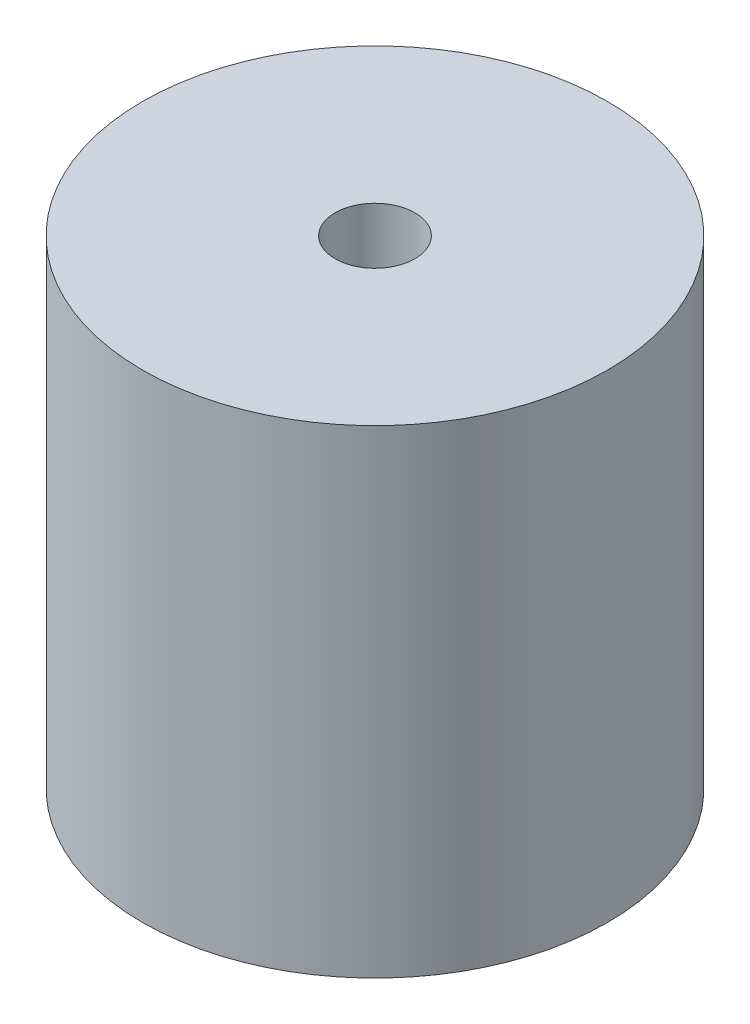
ISO-10303-21;
HEADER;
FILE_DESCRIPTION(('STEP AP214'),'2;1');
FILE_NAME('part.step','',(''),(''),'','','');
FILE_SCHEMA(('AUTOMOTIVE_DESIGN { 1 0 10303 214 1 1 1 1 }'));
ENDSEC;
DATA;
#1=APPLICATION_CONTEXT('core data for automotive mechanical design processes');
#2=APPLICATION_PROTOCOL_DEFINITION('international standard','automotive_design',2000,#1);
#3=PRODUCT_CONTEXT('',#1,'mechanical');
#4=PRODUCT('Part','Part','',(#3));
#5=PRODUCT_RELATED_PRODUCT_CATEGORY('part','',(#4));
#6=PRODUCT_DEFINITION_FORMATION('','',#4);
#7=PRODUCT_DEFINITION_CONTEXT('part definition',#1,'design');
#8=PRODUCT_DEFINITION('design','',#6,#7);
#9=PRODUCT_DEFINITION_SHAPE('','',#8);
#10=(LENGTH_UNIT() NAMED_UNIT(*) SI_UNIT(.MILLI.,.METRE.));
#11=(NAMED_UNIT(*) PLANE_ANGLE_UNIT() SI_UNIT($,.RADIAN.));
#12=(NAMED_UNIT(*) SI_UNIT($,.STERADIAN.) SOLID_ANGLE_UNIT());
#13=UNCERTAINTY_MEASURE_WITH_UNIT(LENGTH_MEASURE(1.E-05),#10,'distance_accuracy_value','');
#14=(GEOMETRIC_REPRESENTATION_CONTEXT(3) GLOBAL_UNCERTAINTY_ASSIGNED_CONTEXT((#13)) GLOBAL_UNIT_ASSIGNED_CONTEXT((#10,
#11,#12)) REPRESENTATION_CONTEXT('',''));
#15=CARTESIAN_POINT('',(0.,0.,0.));
#16=DIRECTION('',(0.,0.,1.));
#17=DIRECTION('',(1.,0.,0.));
#18=AXIS2_PLACEMENT_3D('',#15,#16,#17);
#19=CARTESIAN_POINT('',(0.,36.,0.));
#20=DIRECTION('',(0.,-1.,0.));
#21=DIRECTION('',(0.,0.,-1.));
#22=AXIS2_PLACEMENT_3D('',#19,#20,#21);
#23=CYLINDRICAL_SURFACE('',#22,17.5);
#24=CARTESIAN_POINT('',(0.,36.,0.));
#25=DIRECTION('',(0.,1.,0.));
#26=DIRECTION('',(0.,0.,1.));
#27=AXIS2_PLACEMENT_3D('',#24,#25,#26);
#28=CIRCLE('',#27,17.5);
#29=CARTESIAN_POINT('',(0.,36.,17.5));
#30=VERTEX_POINT('',#29);
#31=EDGE_CURVE('E10',#30,#30,#28,.T.);
#32=ORIENTED_EDGE('',*,*,#31,.F.);
#33=EDGE_LOOP('',(#32));
#34=FACE_BOUND('',#33,.T.);
#35=CARTESIAN_POINT('',(0.,0.,0.));
#36=DIRECTION('',(0.,1.,0.));
#37=DIRECTION('',(0.,0.,1.));
#38=AXIS2_PLACEMENT_3D('',#35,#36,#37);
#39=CIRCLE('',#38,17.5);
#40=CARTESIAN_POINT('',(0.,0.,17.5));
#41=VERTEX_POINT('',#40);
#42=EDGE_CURVE('E34',#41,#41,#39,.T.);
#43=ORIENTED_EDGE('',*,*,#42,.T.);
#44=EDGE_LOOP('',(#43));
#45=FACE_BOUND('',#44,.T.);
#46=ADVANCED_FACE('F31',(#34,#45),#23,.T.);
#47=CARTESIAN_POINT('',(0.,36.,0.));
#48=DIRECTION('',(0.,1.,0.));
#49=DIRECTION('',(0.,0.,1.));
#50=AXIS2_PLACEMENT_3D('',#47,#48,#49);
#51=PLANE('',#50);
#52=CARTESIAN_POINT('',(0.,36.,0.));
#53=DIRECTION('',(0.,1.,0.));
#54=DIRECTION('',(0.,0.,1.));
#55=AXIS2_PLACEMENT_3D('',#52,#53,#54);
#56=CIRCLE('',#55,3.);
#57=CARTESIAN_POINT('',(0.,36.,3.));
#58=VERTEX_POINT('',#57);
#59=EDGE_CURVE('E43',#58,#58,#56,.T.);
#60=ORIENTED_EDGE('',*,*,#59,.F.);
#61=EDGE_LOOP('',(#60));
#62=FACE_BOUND('',#61,.T.);
#63=ORIENTED_EDGE('',*,*,#31,.T.);
#64=EDGE_LOOP('',(#63));
#65=FACE_BOUND('',#64,.T.);
#66=ADVANCED_FACE('F58',(#62,#65),#51,.T.);
#67=CARTESIAN_POINT('',(0.,0.,0.));
#68=DIRECTION('',(0.,1.,0.));
#69=DIRECTION('',(0.,0.,1.));
#70=AXIS2_PLACEMENT_3D('',#67,#68,#69);
#71=PLANE('',#70);
#72=CARTESIAN_POINT('',(0.,0.,0.));
#73=DIRECTION('',(0.,1.,0.));
#74=DIRECTION('',(0.,0.,1.));
#75=AXIS2_PLACEMENT_3D('',#72,#73,#74);
#76=CIRCLE('',#75,3.);
#77=CARTESIAN_POINT('',(0.,0.,3.));
#78=VERTEX_POINT('',#77);
#79=EDGE_CURVE('E41',#78,#78,#76,.T.);
#80=ORIENTED_EDGE('',*,*,#79,.T.);
#81=EDGE_LOOP('',(#80));
#82=FACE_BOUND('',#81,.T.);
#83=ORIENTED_EDGE('',*,*,#42,.F.);
#84=EDGE_LOOP('',(#83));
#85=FACE_BOUND('',#84,.T.);
#86=ADVANCED_FACE('F49',(#82,#85),#71,.F.);
#87=CARTESIAN_POINT('',(0.,0.,0.));
#88=DIRECTION('',(0.,1.,0.));
#89=DIRECTION('',(0.,0.,1.));
#90=AXIS2_PLACEMENT_3D('',#87,#88,#89);
#91=CYLINDRICAL_SURFACE('',#90,3.);
#92=ORIENTED_EDGE('',*,*,#79,.F.);
#93=EDGE_LOOP('',(#92));
#94=FACE_BOUND('',#93,.T.);
#95=ORIENTED_EDGE('',*,*,#59,.T.);
#96=EDGE_LOOP('',(#95));
#97=FACE_BOUND('',#96,.T.);
#98=ADVANCED_FACE('F52',(#94,#97),#91,.F.);
#99=CLOSED_SHELL('',(#46,#66,#86,#98));
#100=MANIFOLD_SOLID_BREP('B2',#99);
#101=ADVANCED_BREP_SHAPE_REPRESENTATION('',(#18,#100),#14);
#102=SHAPE_DEFINITION_REPRESENTATION(#9,#101);
ENDSEC;
END-ISO-10303-21;
